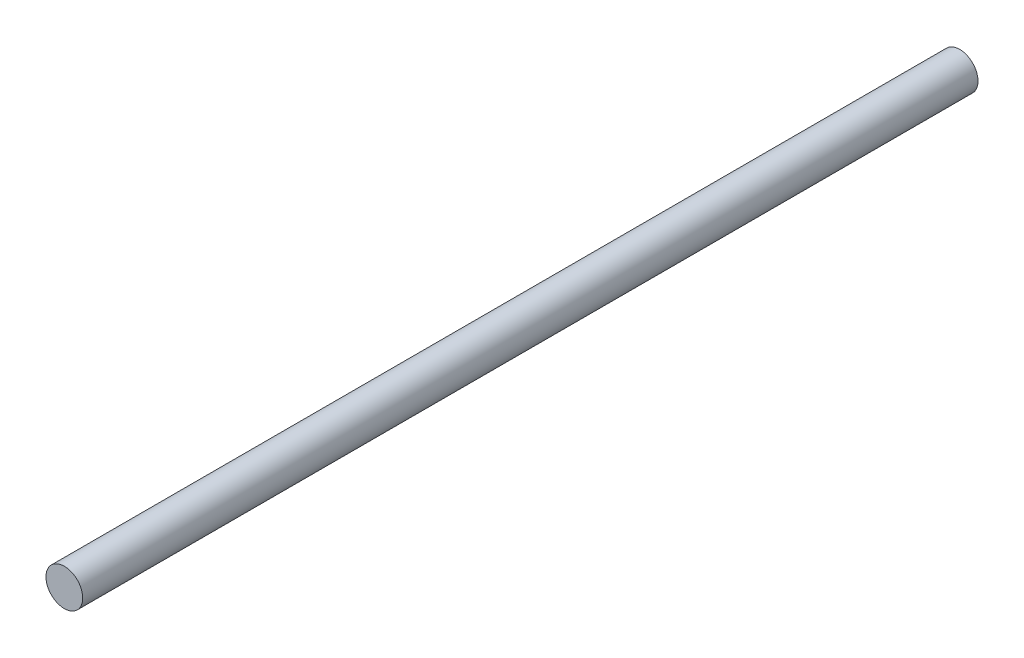
ISO-10303-21;
HEADER;
FILE_DESCRIPTION(('STEP AP214'),'2;1');
FILE_NAME('part.step','',(''),(''),'','','');
FILE_SCHEMA(('AUTOMOTIVE_DESIGN { 1 0 10303 214 1 1 1 1 }'));
ENDSEC;
DATA;
#1=APPLICATION_CONTEXT('core data for automotive mechanical design processes');
#2=APPLICATION_PROTOCOL_DEFINITION('international standard','automotive_design',2000,#1);
#3=PRODUCT_CONTEXT('',#1,'mechanical');
#4=PRODUCT('Part','Part','',(#3));
#5=PRODUCT_RELATED_PRODUCT_CATEGORY('part','',(#4));
#6=PRODUCT_DEFINITION_FORMATION('','',#4);
#7=PRODUCT_DEFINITION_CONTEXT('part definition',#1,'design');
#8=PRODUCT_DEFINITION('design','',#6,#7);
#9=PRODUCT_DEFINITION_SHAPE('','',#8);
#10=(LENGTH_UNIT() NAMED_UNIT(*) SI_UNIT(.MILLI.,.METRE.));
#11=(NAMED_UNIT(*) PLANE_ANGLE_UNIT() SI_UNIT($,.RADIAN.));
#12=(NAMED_UNIT(*) SI_UNIT($,.STERADIAN.) SOLID_ANGLE_UNIT());
#13=UNCERTAINTY_MEASURE_WITH_UNIT(LENGTH_MEASURE(1.E-05),#10,'distance_accuracy_value','');
#14=(GEOMETRIC_REPRESENTATION_CONTEXT(3) GLOBAL_UNCERTAINTY_ASSIGNED_CONTEXT((#13)) GLOBAL_UNIT_ASSIGNED_CONTEXT((#10,
#11,#12)) REPRESENTATION_CONTEXT('',''));
#15=CARTESIAN_POINT('',(0.,0.,0.));
#16=DIRECTION('',(0.,0.,1.));
#17=DIRECTION('',(1.,0.,0.));
#18=AXIS2_PLACEMENT_3D('',#15,#16,#17);
#19=CARTESIAN_POINT('',(0.,0.,195.));
#20=DIRECTION('',(0.,0.,-1.));
#21=DIRECTION('',(-1.,0.,0.));
#22=AXIS2_PLACEMENT_3D('',#19,#20,#21);
#23=CYLINDRICAL_SURFACE('',#22,4.);
#24=CARTESIAN_POINT('',(0.,0.,195.));
#25=DIRECTION('',(0.,0.,1.));
#26=DIRECTION('',(1.,0.,0.));
#27=AXIS2_PLACEMENT_3D('',#24,#25,#26);
#28=CIRCLE('',#27,4.);
#29=CARTESIAN_POINT('',(4.,0.,195.));
#30=VERTEX_POINT('',#29);
#31=EDGE_CURVE('E10',#30,#30,#28,.T.);
#32=ORIENTED_EDGE('',*,*,#31,.F.);
#33=EDGE_LOOP('',(#32));
#34=FACE_BOUND('',#33,.T.);
#35=CARTESIAN_POINT('',(0.,0.,0.));
#36=DIRECTION('',(0.,0.,1.));
#37=DIRECTION('',(1.,0.,0.));
#38=AXIS2_PLACEMENT_3D('',#35,#36,#37);
#39=CIRCLE('',#38,4.);
#40=CARTESIAN_POINT('',(4.,0.,0.));
#41=VERTEX_POINT('',#40);
#42=EDGE_CURVE('E36',#41,#41,#39,.T.);
#43=ORIENTED_EDGE('',*,*,#42,.T.);
#44=EDGE_LOOP('',(#43));
#45=FACE_BOUND('',#44,.T.);
#46=ADVANCED_FACE('F33',(#34,#45),#23,.T.);
#47=CARTESIAN_POINT('',(0.,0.,195.));
#48=DIRECTION('',(0.,0.,1.));
#49=DIRECTION('',(1.,0.,0.));
#50=AXIS2_PLACEMENT_3D('',#47,#48,#49);
#51=PLANE('',#50);
#52=ORIENTED_EDGE('',*,*,#31,.T.);
#53=EDGE_LOOP('',(#52));
#54=FACE_BOUND('',#53,.T.);
#55=ADVANCED_FACE('F48',(#54),#51,.T.);
#56=CARTESIAN_POINT('',(0.,0.,0.));
#57=DIRECTION('',(0.,0.,1.));
#58=DIRECTION('',(1.,0.,0.));
#59=AXIS2_PLACEMENT_3D('',#56,#57,#58);
#60=PLANE('',#59);
#61=ORIENTED_EDGE('',*,*,#42,.F.);
#62=EDGE_LOOP('',(#61));
#63=FACE_BOUND('',#62,.T.);
#64=ADVANCED_FACE('F46',(#63),#60,.F.);
#65=CLOSED_SHELL('',(#46,#55,#64));
#66=MANIFOLD_SOLID_BREP('B2',#65);
#67=ADVANCED_BREP_SHAPE_REPRESENTATION('',(#18,#66),#14);
#68=SHAPE_DEFINITION_REPRESENTATION(#9,#67);
ENDSEC;
END-ISO-10303-21;
